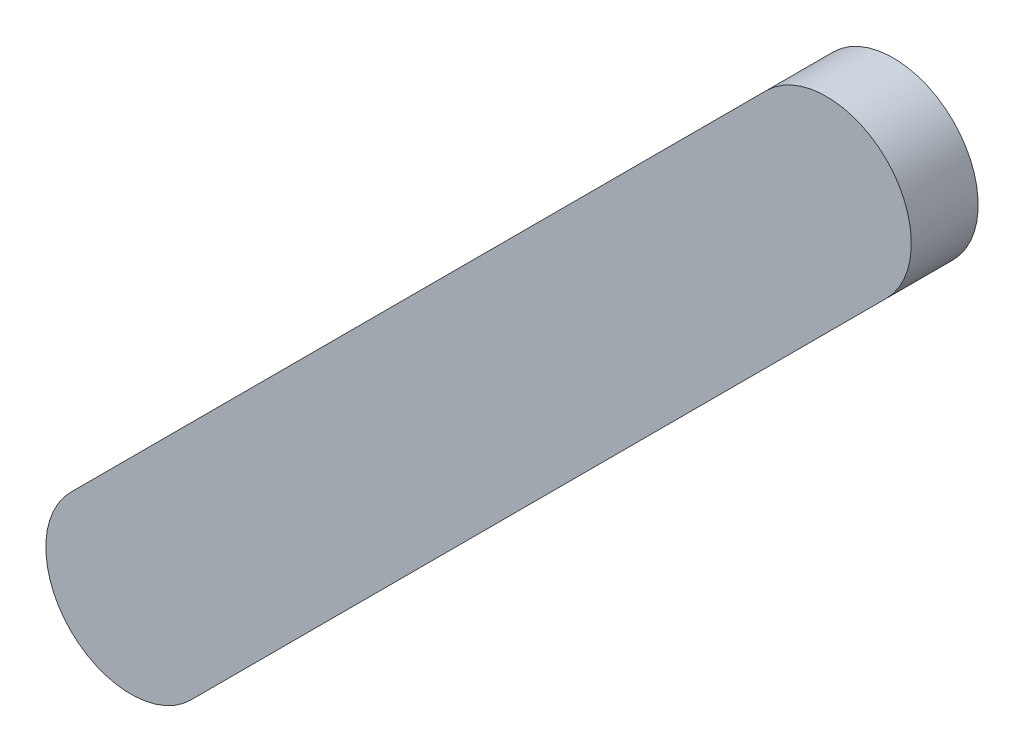
ISO-10303-21;
HEADER;
FILE_DESCRIPTION(('STEP AP214'),'2;1');
FILE_NAME('part.step','',(''),(''),'','','');
FILE_SCHEMA(('AUTOMOTIVE_DESIGN { 1 0 10303 214 1 1 1 1 }'));
ENDSEC;
DATA;
#1=APPLICATION_CONTEXT('core data for automotive mechanical design processes');
#2=APPLICATION_PROTOCOL_DEFINITION('international standard','automotive_design',2000,#1);
#3=PRODUCT_CONTEXT('',#1,'mechanical');
#4=PRODUCT('Part','Part','',(#3));
#5=PRODUCT_RELATED_PRODUCT_CATEGORY('part','',(#4));
#6=PRODUCT_DEFINITION_FORMATION('','',#4);
#7=PRODUCT_DEFINITION_CONTEXT('part definition',#1,'design');
#8=PRODUCT_DEFINITION('design','',#6,#7);
#9=PRODUCT_DEFINITION_SHAPE('','',#8);
#10=(LENGTH_UNIT() NAMED_UNIT(*) SI_UNIT(.MILLI.,.METRE.));
#11=(NAMED_UNIT(*) PLANE_ANGLE_UNIT() SI_UNIT($,.RADIAN.));
#12=(NAMED_UNIT(*) SI_UNIT($,.STERADIAN.) SOLID_ANGLE_UNIT());
#13=UNCERTAINTY_MEASURE_WITH_UNIT(LENGTH_MEASURE(1.E-05),#10,'distance_accuracy_value','');
#14=(GEOMETRIC_REPRESENTATION_CONTEXT(3) GLOBAL_UNCERTAINTY_ASSIGNED_CONTEXT((#13)) GLOBAL_UNIT_ASSIGNED_CONTEXT((#10,
#11,#12)) REPRESENTATION_CONTEXT('',''));
#15=CARTESIAN_POINT('',(0.,0.,0.));
#16=DIRECTION('',(0.,0.,1.));
#17=DIRECTION('',(1.,0.,0.));
#18=AXIS2_PLACEMENT_3D('',#15,#16,#17);
#19=CARTESIAN_POINT('',(136.5268034,52.60159406,0.));
#20=DIRECTION('',(-0.70710678118655,0.707106781186545,0.));
#21=DIRECTION('',(0.707106781186545,0.70710678118655,0.));
#22=AXIS2_PLACEMENT_3D('',#19,#20,#21);
#23=PLANE('',#22);
#24=DIRECTION('',(0.707106781186545,0.70710678118655,0.));
#25=VECTOR('',#24,1.);
#26=CARTESIAN_POINT('',(136.5268034,52.60159406,0.1999996));
#27=LINE('',#26,#25);
#28=CARTESIAN_POINT('',(136.5268034,52.60159406,0.1999996));
#29=VERTEX_POINT('',#28);
#30=CARTESIAN_POINT('',(138.60960594,54.6843966,0.1999996));
#31=VERTEX_POINT('',#30);
#32=EDGE_CURVE('E11',#29,#31,#27,.T.);
#33=ORIENTED_EDGE('',*,*,#32,.F.);
#34=DIRECTION('',(0.,0.,1.));
#35=VECTOR('',#34,1.);
#36=CARTESIAN_POINT('',(136.5268034,52.60159406,0.));
#37=LINE('',#36,#35);
#38=CARTESIAN_POINT('',(136.5268034,52.60159406,0.));
#39=VERTEX_POINT('',#38);
#40=EDGE_CURVE('E24',#39,#29,#37,.T.);
#41=ORIENTED_EDGE('',*,*,#40,.F.);
#42=DIRECTION('',(0.707106781186545,0.70710678118655,0.));
#43=VECTOR('',#42,1.);
#44=CARTESIAN_POINT('',(136.5268034,52.60159406,0.));
#45=LINE('',#44,#43);
#46=CARTESIAN_POINT('',(138.60960594,54.6843966,0.));
#47=VERTEX_POINT('',#46);
#48=EDGE_CURVE('E75',#39,#47,#45,.T.);
#49=ORIENTED_EDGE('',*,*,#48,.T.);
#50=DIRECTION('',(0.,0.,1.));
#51=VECTOR('',#50,1.);
#52=CARTESIAN_POINT('',(138.60960594,54.6843966,0.));
#53=LINE('',#52,#51);
#54=EDGE_CURVE('E37',#47,#31,#53,.T.);
#55=ORIENTED_EDGE('',*,*,#54,.T.);
#56=EDGE_LOOP('',(#33,#41,#49,#55));
#57=FACE_BOUND('',#56,.T.);
#58=ADVANCED_FACE('F17',(#57),#23,.F.);
#59=CARTESIAN_POINT('',(138.43000127,54.86400127,0.));
#60=DIRECTION('',(0.,0.,-1.));
#61=DIRECTION('',(0.707106781186548,-0.707106781186548,0.));
#62=AXIS2_PLACEMENT_3D('',#59,#60,#61);
#63=CYLINDRICAL_SURFACE('',#62,0.253999360179549);
#64=CARTESIAN_POINT('',(138.43000127,54.86400127,0.1999996));
#65=DIRECTION('',(0.,0.,1.));
#66=DIRECTION('',(0.707106781186548,-0.707106781186548,0.));
#67=AXIS2_PLACEMENT_3D('',#64,#65,#66);
#68=CIRCLE('',#67,0.253999360179549);
#69=CARTESIAN_POINT('',(138.2503966,55.04360594,0.1999996));
#70=VERTEX_POINT('',#69);
#71=EDGE_CURVE('E83',#31,#70,#68,.T.);
#72=ORIENTED_EDGE('',*,*,#71,.F.);
#73=ORIENTED_EDGE('',*,*,#54,.F.);
#74=CARTESIAN_POINT('',(138.43000127,54.86400127,0.));
#75=DIRECTION('',(0.,0.,1.));
#76=DIRECTION('',(0.707106781186548,-0.707106781186548,0.));
#77=AXIS2_PLACEMENT_3D('',#74,#75,#76);
#78=CIRCLE('',#77,0.253999360179549);
#79=CARTESIAN_POINT('',(138.2503966,55.04360594,0.));
#80=VERTEX_POINT('',#79);
#81=EDGE_CURVE('E81',#47,#80,#78,.T.);
#82=ORIENTED_EDGE('',*,*,#81,.T.);
#83=DIRECTION('',(0.,0.,1.));
#84=VECTOR('',#83,1.);
#85=CARTESIAN_POINT('',(138.2503966,55.04360594,0.));
#86=LINE('',#85,#84);
#87=EDGE_CURVE('E67',#80,#70,#86,.T.);
#88=ORIENTED_EDGE('',*,*,#87,.T.);
#89=EDGE_LOOP('',(#72,#73,#82,#88));
#90=FACE_BOUND('',#89,.T.);
#91=ADVANCED_FACE('F89',(#90),#63,.T.);
#92=CARTESIAN_POINT('',(138.2503966,55.04360594,0.));
#93=DIRECTION('',(0.707106781186551,-0.707106781186544,0.));
#94=DIRECTION('',(-0.707106781186544,-0.707106781186551,0.));
#95=AXIS2_PLACEMENT_3D('',#92,#93,#94);
#96=PLANE('',#95);
#97=DIRECTION('',(-0.707106781186544,-0.707106781186551,0.));
#98=VECTOR('',#97,1.);
#99=CARTESIAN_POINT('',(138.2503966,55.04360594,0.1999996));
#100=LINE('',#99,#98);
#101=CARTESIAN_POINT('',(136.16759406,52.9608034,0.1999996));
#102=VERTEX_POINT('',#101);
#103=EDGE_CURVE('E71',#70,#102,#100,.T.);
#104=ORIENTED_EDGE('',*,*,#103,.F.);
#105=ORIENTED_EDGE('',*,*,#87,.F.);
#106=DIRECTION('',(-0.707106781186544,-0.707106781186551,0.));
#107=VECTOR('',#106,1.);
#108=CARTESIAN_POINT('',(138.2503966,55.04360594,0.));
#109=LINE('',#108,#107);
#110=CARTESIAN_POINT('',(136.16759406,52.9608034,0.));
#111=VERTEX_POINT('',#110);
#112=EDGE_CURVE('E63',#80,#111,#109,.T.);
#113=ORIENTED_EDGE('',*,*,#112,.T.);
#114=DIRECTION('',(0.,0.,1.));
#115=VECTOR('',#114,1.);
#116=CARTESIAN_POINT('',(136.16759406,52.9608034,0.));
#117=LINE('',#116,#115);
#118=EDGE_CURVE('E53',#111,#102,#117,.T.);
#119=ORIENTED_EDGE('',*,*,#118,.T.);
#120=EDGE_LOOP('',(#104,#105,#113,#119));
#121=FACE_BOUND('',#120,.T.);
#122=ADVANCED_FACE('F66',(#121),#96,.F.);
#123=CARTESIAN_POINT('',(136.34719873,52.78119873,0.));
#124=DIRECTION('',(0.,0.,-1.));
#125=DIRECTION('',(-0.707106781186562,0.707106781186534,0.));
#126=AXIS2_PLACEMENT_3D('',#123,#124,#125);
#127=CYLINDRICAL_SURFACE('',#126,0.253999360179547);
#128=CARTESIAN_POINT('',(136.34719873,52.78119873,0.1999996));
#129=DIRECTION('',(0.,0.,1.));
#130=DIRECTION('',(-0.707106781186562,0.707106781186534,0.));
#131=AXIS2_PLACEMENT_3D('',#128,#129,#130);
#132=CIRCLE('',#131,0.253999360179547);
#133=EDGE_CURVE('E59',#102,#29,#132,.T.);
#134=ORIENTED_EDGE('',*,*,#133,.F.);
#135=ORIENTED_EDGE('',*,*,#118,.F.);
#136=CARTESIAN_POINT('',(136.34719873,52.78119873,0.));
#137=DIRECTION('',(0.,0.,1.));
#138=DIRECTION('',(-0.707106781186562,0.707106781186534,0.));
#139=AXIS2_PLACEMENT_3D('',#136,#137,#138);
#140=CIRCLE('',#139,0.253999360179547);
#141=EDGE_CURVE('E57',#111,#39,#140,.T.);
#142=ORIENTED_EDGE('',*,*,#141,.T.);
#143=ORIENTED_EDGE('',*,*,#40,.T.);
#144=EDGE_LOOP('',(#134,#135,#142,#143));
#145=FACE_BOUND('',#144,.T.);
#146=ADVANCED_FACE('F55',(#145),#127,.T.);
#147=CARTESIAN_POINT('',(136.5268034,52.60159406,0.));
#148=DIRECTION('',(0.,0.,-1.));
#149=DIRECTION('',(-1.,0.,0.));
#150=AXIS2_PLACEMENT_3D('',#147,#148,#149);
#151=PLANE('',#150);
#152=ORIENTED_EDGE('',*,*,#141,.F.);
#153=ORIENTED_EDGE('',*,*,#112,.F.);
#154=ORIENTED_EDGE('',*,*,#81,.F.);
#155=ORIENTED_EDGE('',*,*,#48,.F.);
#156=EDGE_LOOP('',(#152,#153,#154,#155));
#157=FACE_BOUND('',#156,.T.);
#158=ADVANCED_FACE('F74',(#157),#151,.T.);
#159=CARTESIAN_POINT('',(136.5268034,52.60159406,0.1999996));
#160=DIRECTION('',(0.,0.,-1.));
#161=DIRECTION('',(-1.,0.,0.));
#162=AXIS2_PLACEMENT_3D('',#159,#160,#161);
#163=PLANE('',#162);
#164=ORIENTED_EDGE('',*,*,#32,.T.);
#165=ORIENTED_EDGE('',*,*,#71,.T.);
#166=ORIENTED_EDGE('',*,*,#103,.T.);
#167=ORIENTED_EDGE('',*,*,#133,.T.);
#168=EDGE_LOOP('',(#164,#165,#166,#167));
#169=FACE_BOUND('',#168,.T.);
#170=ADVANCED_FACE('F91',(#169),#163,.F.);
#171=CLOSED_SHELL('',(#58,#91,#122,#146,#158,#170));
#172=MANIFOLD_SOLID_BREP('B1',#171);
#173=ADVANCED_BREP_SHAPE_REPRESENTATION('',(#18,#172),#14);
#174=SHAPE_DEFINITION_REPRESENTATION(#9,#173);
ENDSEC;
END-ISO-10303-21;
